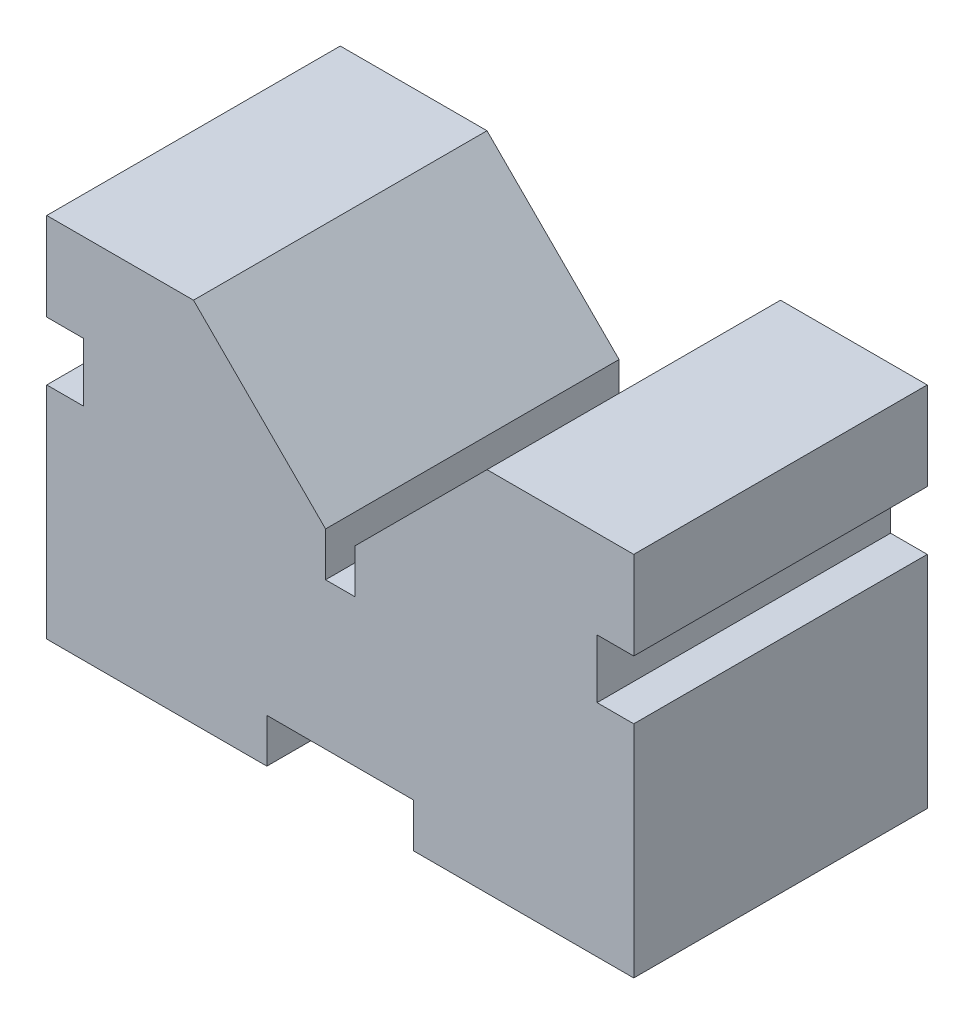
ISO-10303-21;
HEADER;
FILE_DESCRIPTION(('STEP AP214'),'2;1');
FILE_NAME('part.step','',(''),(''),'','','');
FILE_SCHEMA(('AUTOMOTIVE_DESIGN { 1 0 10303 214 1 1 1 1 }'));
ENDSEC;
DATA;
#1=APPLICATION_CONTEXT('core data for automotive mechanical design processes');
#2=APPLICATION_PROTOCOL_DEFINITION('international standard','automotive_design',2000,#1);
#3=PRODUCT_CONTEXT('',#1,'mechanical');
#4=PRODUCT('Part','Part','',(#3));
#5=PRODUCT_RELATED_PRODUCT_CATEGORY('part','',(#4));
#6=PRODUCT_DEFINITION_FORMATION('','',#4);
#7=PRODUCT_DEFINITION_CONTEXT('part definition',#1,'design');
#8=PRODUCT_DEFINITION('design','',#6,#7);
#9=PRODUCT_DEFINITION_SHAPE('','',#8);
#10=(LENGTH_UNIT() NAMED_UNIT(*) SI_UNIT(.MILLI.,.METRE.));
#11=(NAMED_UNIT(*) PLANE_ANGLE_UNIT() SI_UNIT($,.RADIAN.));
#12=(NAMED_UNIT(*) SI_UNIT($,.STERADIAN.) SOLID_ANGLE_UNIT());
#13=UNCERTAINTY_MEASURE_WITH_UNIT(LENGTH_MEASURE(1.E-05),#10,'distance_accuracy_value','');
#14=(GEOMETRIC_REPRESENTATION_CONTEXT(3) GLOBAL_UNCERTAINTY_ASSIGNED_CONTEXT((#13)) GLOBAL_UNIT_ASSIGNED_CONTEXT((#10,
#11,#12)) REPRESENTATION_CONTEXT('',''));
#15=CARTESIAN_POINT('',(0.,0.,0.));
#16=DIRECTION('',(0.,0.,1.));
#17=DIRECTION('',(1.,0.,0.));
#18=AXIS2_PLACEMENT_3D('',#15,#16,#17);
#19=CARTESIAN_POINT('',(-40.,50.,20.));
#20=DIRECTION('',(1.,0.,0.));
#21=DIRECTION('',(0.,0.,-1.));
#22=AXIS2_PLACEMENT_3D('',#19,#20,#21);
#23=PLANE('',#22);
#24=DIRECTION('',(0.,-1.,0.));
#25=VECTOR('',#24,1.);
#26=CARTESIAN_POINT('',(-40.,50.,-20.));
#27=LINE('',#26,#25);
#28=CARTESIAN_POINT('',(-40.,50.,-20.));
#29=VERTEX_POINT('',#28);
#30=CARTESIAN_POINT('',(-40.,38.,-20.));
#31=VERTEX_POINT('',#30);
#32=EDGE_CURVE('E396',#29,#31,#27,.T.);
#33=ORIENTED_EDGE('',*,*,#32,.T.);
#34=DIRECTION('',(0.,0.,1.));
#35=VECTOR('',#34,1.);
#36=CARTESIAN_POINT('',(-40.,38.,-81.));
#37=LINE('',#36,#35);
#38=CARTESIAN_POINT('',(-40.,38.,20.));
#39=VERTEX_POINT('',#38);
#40=EDGE_CURVE('E253',#31,#39,#37,.T.);
#41=ORIENTED_EDGE('',*,*,#40,.T.);
#42=DIRECTION('',(0.,-1.,0.));
#43=VECTOR('',#42,1.);
#44=CARTESIAN_POINT('',(-40.,50.,20.));
#45=LINE('',#44,#43);
#46=CARTESIAN_POINT('',(-40.,50.,20.));
#47=VERTEX_POINT('',#46);
#48=EDGE_CURVE('E409',#47,#39,#45,.T.);
#49=ORIENTED_EDGE('',*,*,#48,.F.);
#50=DIRECTION('',(0.,0.,1.));
#51=VECTOR('',#50,1.);
#52=CARTESIAN_POINT('',(-40.,50.,20.));
#53=LINE('',#52,#51);
#54=EDGE_CURVE('E362',#29,#47,#53,.T.);
#55=ORIENTED_EDGE('',*,*,#54,.F.);
#56=EDGE_LOOP('',(#33,#41,#49,#55));
#57=FACE_BOUND('',#56,.T.);
#58=ADVANCED_FACE('F51',(#57),#23,.F.);
#59=CARTESIAN_POINT('',(40.,50.,-20.));
#60=DIRECTION('',(-1.,0.,0.));
#61=DIRECTION('',(0.,0.,1.));
#62=AXIS2_PLACEMENT_3D('',#59,#60,#61);
#63=PLANE('',#62);
#64=DIRECTION('',(0.,-1.,0.));
#65=VECTOR('',#64,1.);
#66=CARTESIAN_POINT('',(40.,50.,20.));
#67=LINE('',#66,#65);
#68=CARTESIAN_POINT('',(40.,50.,20.));
#69=VERTEX_POINT('',#68);
#70=CARTESIAN_POINT('',(40.,38.,20.));
#71=VERTEX_POINT('',#70);
#72=EDGE_CURVE('E404',#69,#71,#67,.T.);
#73=ORIENTED_EDGE('',*,*,#72,.T.);
#74=DIRECTION('',(0.,0.,1.));
#75=VECTOR('',#74,1.);
#76=CARTESIAN_POINT('',(40.,38.,-81.));
#77=LINE('',#76,#75);
#78=CARTESIAN_POINT('',(40.,38.,-20.));
#79=VERTEX_POINT('',#78);
#80=EDGE_CURVE('E268',#79,#71,#77,.T.);
#81=ORIENTED_EDGE('',*,*,#80,.F.);
#82=DIRECTION('',(0.,-1.,0.));
#83=VECTOR('',#82,1.);
#84=CARTESIAN_POINT('',(40.,50.,-20.));
#85=LINE('',#84,#83);
#86=CARTESIAN_POINT('',(40.,50.,-20.));
#87=VERTEX_POINT('',#86);
#88=EDGE_CURVE('E400',#87,#79,#85,.T.);
#89=ORIENTED_EDGE('',*,*,#88,.F.);
#90=DIRECTION('',(0.,0.,-1.));
#91=VECTOR('',#90,1.);
#92=CARTESIAN_POINT('',(40.,50.,-20.));
#93=LINE('',#92,#91);
#94=EDGE_CURVE('E372',#69,#87,#93,.T.);
#95=ORIENTED_EDGE('',*,*,#94,.F.);
#96=EDGE_LOOP('',(#73,#81,#89,#95));
#97=FACE_BOUND('',#96,.T.);
#98=ADVANCED_FACE('F479',(#97),#63,.F.);
#99=CARTESIAN_POINT('',(0.,0.,0.));
#100=DIRECTION('',(0.,-1.,0.));
#101=DIRECTION('',(0.,0.,-1.));
#102=AXIS2_PLACEMENT_3D('',#99,#100,#101);
#103=PLANE('',#102);
#104=DIRECTION('',(0.,0.,-1.));
#105=VECTOR('',#104,1.);
#106=CARTESIAN_POINT('',(-10.,0.,0.));
#107=LINE('',#106,#105);
#108=CARTESIAN_POINT('',(-10.,0.,20.));
#109=VERTEX_POINT('',#108);
#110=CARTESIAN_POINT('',(-10.,0.,-20.));
#111=VERTEX_POINT('',#110);
#112=EDGE_CURVE('E435',#109,#111,#107,.T.);
#113=ORIENTED_EDGE('',*,*,#112,.F.);
#114=DIRECTION('',(1.,0.,0.));
#115=VECTOR('',#114,1.);
#116=CARTESIAN_POINT('',(40.,0.,20.));
#117=LINE('',#116,#115);
#118=CARTESIAN_POINT('',(-40.,0.,20.));
#119=VERTEX_POINT('',#118);
#120=EDGE_CURVE('E385',#119,#109,#117,.T.);
#121=ORIENTED_EDGE('',*,*,#120,.F.);
#122=DIRECTION('',(0.,0.,1.));
#123=VECTOR('',#122,1.);
#124=CARTESIAN_POINT('',(-40.,0.,20.));
#125=LINE('',#124,#123);
#126=CARTESIAN_POINT('',(-40.,0.,-20.));
#127=VERTEX_POINT('',#126);
#128=EDGE_CURVE('E361',#127,#119,#125,.T.);
#129=ORIENTED_EDGE('',*,*,#128,.F.);
#130=DIRECTION('',(-1.,0.,0.));
#131=VECTOR('',#130,1.);
#132=CARTESIAN_POINT('',(-40.,0.,-20.));
#133=LINE('',#132,#131);
#134=EDGE_CURVE('E393',#111,#127,#133,.T.);
#135=ORIENTED_EDGE('',*,*,#134,.F.);
#136=EDGE_LOOP('',(#113,#121,#129,#135));
#137=FACE_BOUND('',#136,.T.);
#138=ADVANCED_FACE('F464',(#137),#103,.T.);
#139=CARTESIAN_POINT('',(0.,50.,0.));
#140=DIRECTION('',(0.,-1.,0.));
#141=DIRECTION('',(0.,0.,-1.));
#142=AXIS2_PLACEMENT_3D('',#139,#140,#141);
#143=PLANE('',#142);
#144=DIRECTION('',(1.,0.,0.));
#145=VECTOR('',#144,1.);
#146=CARTESIAN_POINT('',(40.,50.,20.));
#147=LINE('',#146,#145);
#148=CARTESIAN_POINT('',(-20.,50.,20.));
#149=VERTEX_POINT('',#148);
#150=EDGE_CURVE('E368',#47,#149,#147,.T.);
#151=ORIENTED_EDGE('',*,*,#150,.T.);
#152=DIRECTION('',(0.,0.,-1.));
#153=VECTOR('',#152,1.);
#154=CARTESIAN_POINT('',(-20.,50.,0.));
#155=LINE('',#154,#153);
#156=CARTESIAN_POINT('',(-20.,50.,-20.));
#157=VERTEX_POINT('',#156);
#158=EDGE_CURVE('E417',#149,#157,#155,.T.);
#159=ORIENTED_EDGE('',*,*,#158,.T.);
#160=DIRECTION('',(-1.,0.,0.));
#161=VECTOR('',#160,1.);
#162=CARTESIAN_POINT('',(-40.,50.,-20.));
#163=LINE('',#162,#161);
#164=EDGE_CURVE('E375',#157,#29,#163,.T.);
#165=ORIENTED_EDGE('',*,*,#164,.T.);
#166=ORIENTED_EDGE('',*,*,#54,.T.);
#167=EDGE_LOOP('',(#151,#159,#165,#166));
#168=FACE_BOUND('',#167,.T.);
#169=ADVANCED_FACE('F498',(#168),#143,.F.);
#170=CARTESIAN_POINT('',(-40.,30.,20.));
#171=VERTEX_POINT('',#170);
#172=EDGE_CURVE('E408',#171,#119,#45,.T.);
#173=ORIENTED_EDGE('',*,*,#172,.F.);
#174=DIRECTION('',(0.,0.,1.));
#175=VECTOR('',#174,1.);
#176=CARTESIAN_POINT('',(-40.,30.,-81.));
#177=LINE('',#176,#175);
#178=CARTESIAN_POINT('',(-40.,30.,-20.));
#179=VERTEX_POINT('',#178);
#180=EDGE_CURVE('E219',#179,#171,#177,.T.);
#181=ORIENTED_EDGE('',*,*,#180,.F.);
#182=EDGE_CURVE('E380',#179,#127,#27,.T.);
#183=ORIENTED_EDGE('',*,*,#182,.T.);
#184=ORIENTED_EDGE('',*,*,#128,.T.);
#185=EDGE_LOOP('',(#173,#181,#183,#184));
#186=FACE_BOUND('',#185,.T.);
#187=ADVANCED_FACE('F54',(#186),#23,.F.);
#188=CARTESIAN_POINT('',(40.,50.,20.));
#189=DIRECTION('',(0.,0.,-1.));
#190=DIRECTION('',(-1.,0.,0.));
#191=AXIS2_PLACEMENT_3D('',#188,#189,#190);
#192=PLANE('',#191);
#193=ORIENTED_EDGE('',*,*,#48,.T.);
#194=DIRECTION('',(1.,0.,0.));
#195=VECTOR('',#194,1.);
#196=CARTESIAN_POINT('',(40.,38.,20.));
#197=LINE('',#196,#195);
#198=CARTESIAN_POINT('',(-35.,38.,20.));
#199=VERTEX_POINT('',#198);
#200=EDGE_CURVE('E288',#39,#199,#197,.T.);
#201=ORIENTED_EDGE('',*,*,#200,.T.);
#202=DIRECTION('',(0.,-1.,0.));
#203=VECTOR('',#202,1.);
#204=CARTESIAN_POINT('',(-35.,50.,20.));
#205=LINE('',#204,#203);
#206=CARTESIAN_POINT('',(-35.,30.,20.));
#207=VERTEX_POINT('',#206);
#208=EDGE_CURVE('E249',#199,#207,#205,.T.);
#209=ORIENTED_EDGE('',*,*,#208,.T.);
#210=DIRECTION('',(-1.,0.,0.));
#211=VECTOR('',#210,1.);
#212=CARTESIAN_POINT('',(40.,30.,20.));
#213=LINE('',#212,#211);
#214=EDGE_CURVE('E282',#207,#171,#213,.T.);
#215=ORIENTED_EDGE('',*,*,#214,.T.);
#216=ORIENTED_EDGE('',*,*,#172,.T.);
#217=ORIENTED_EDGE('',*,*,#120,.T.);
#218=DIRECTION('',(0.,1.,0.));
#219=VECTOR('',#218,1.);
#220=CARTESIAN_POINT('',(-10.,50.,20.));
#221=LINE('',#220,#219);
#222=CARTESIAN_POINT('',(-10.,6.,20.));
#223=VERTEX_POINT('',#222);
#224=EDGE_CURVE('E310',#109,#223,#221,.T.);
#225=ORIENTED_EDGE('',*,*,#224,.T.);
#226=DIRECTION('',(1.,0.,0.));
#227=VECTOR('',#226,1.);
#228=CARTESIAN_POINT('',(40.,6.,20.));
#229=LINE('',#228,#227);
#230=CARTESIAN_POINT('',(10.,6.,20.));
#231=VERTEX_POINT('',#230);
#232=EDGE_CURVE('E314',#223,#231,#229,.T.);
#233=ORIENTED_EDGE('',*,*,#232,.T.);
#234=DIRECTION('',(0.,-1.,0.));
#235=VECTOR('',#234,1.);
#236=CARTESIAN_POINT('',(10.,50.,20.));
#237=LINE('',#236,#235);
#238=CARTESIAN_POINT('',(10.,0.,20.));
#239=VERTEX_POINT('',#238);
#240=EDGE_CURVE('E303',#231,#239,#237,.T.);
#241=ORIENTED_EDGE('',*,*,#240,.T.);
#242=CARTESIAN_POINT('',(40.,0.,20.));
#243=VERTEX_POINT('',#242);
#244=EDGE_CURVE('E384',#239,#243,#117,.T.);
#245=ORIENTED_EDGE('',*,*,#244,.T.);
#246=CARTESIAN_POINT('',(40.,30.,20.));
#247=VERTEX_POINT('',#246);
#248=EDGE_CURVE('E403',#247,#243,#67,.T.);
#249=ORIENTED_EDGE('',*,*,#248,.F.);
#250=DIRECTION('',(-1.,0.,0.));
#251=VECTOR('',#250,1.);
#252=CARTESIAN_POINT('',(40.,30.,20.));
#253=LINE('',#252,#251);
#254=CARTESIAN_POINT('',(35.,30.,20.));
#255=VERTEX_POINT('',#254);
#256=EDGE_CURVE('E259',#247,#255,#253,.T.);
#257=ORIENTED_EDGE('',*,*,#256,.T.);
#258=DIRECTION('',(0.,1.,0.));
#259=VECTOR('',#258,1.);
#260=CARTESIAN_POINT('',(35.,50.,20.));
#261=LINE('',#260,#259);
#262=CARTESIAN_POINT('',(35.,38.,20.));
#263=VERTEX_POINT('',#262);
#264=EDGE_CURVE('E217',#255,#263,#261,.T.);
#265=ORIENTED_EDGE('',*,*,#264,.T.);
#266=DIRECTION('',(1.,0.,0.));
#267=VECTOR('',#266,1.);
#268=CARTESIAN_POINT('',(40.,38.,20.));
#269=LINE('',#268,#267);
#270=EDGE_CURVE('E276',#263,#71,#269,.T.);
#271=ORIENTED_EDGE('',*,*,#270,.T.);
#272=ORIENTED_EDGE('',*,*,#72,.F.);
#273=CARTESIAN_POINT('',(20.,50.,20.));
#274=VERTEX_POINT('',#273);
#275=EDGE_CURVE('E366',#274,#69,#147,.T.);
#276=ORIENTED_EDGE('',*,*,#275,.F.);
#277=DIRECTION('',(-0.707106781186548,-0.707106781186548,0.));
#278=VECTOR('',#277,1.);
#279=CARTESIAN_POINT('',(30.,60.,20.));
#280=LINE('',#279,#278);
#281=CARTESIAN_POINT('',(2.,32.,20.));
#282=VERTEX_POINT('',#281);
#283=EDGE_CURVE('E338',#274,#282,#280,.T.);
#284=ORIENTED_EDGE('',*,*,#283,.T.);
#285=DIRECTION('',(0.,-1.,0.));
#286=VECTOR('',#285,1.);
#287=CARTESIAN_POINT('',(2.,50.,20.));
#288=LINE('',#287,#286);
#289=CARTESIAN_POINT('',(2.,26.,20.));
#290=VERTEX_POINT('',#289);
#291=EDGE_CURVE('E358',#282,#290,#288,.T.);
#292=ORIENTED_EDGE('',*,*,#291,.T.);
#293=DIRECTION('',(-1.,0.,0.));
#294=VECTOR('',#293,1.);
#295=CARTESIAN_POINT('',(40.,26.,20.));
#296=LINE('',#295,#294);
#297=CARTESIAN_POINT('',(-2.,26.,20.));
#298=VERTEX_POINT('',#297);
#299=EDGE_CURVE('E354',#290,#298,#296,.T.);
#300=ORIENTED_EDGE('',*,*,#299,.T.);
#301=DIRECTION('',(0.,1.,0.));
#302=VECTOR('',#301,1.);
#303=CARTESIAN_POINT('',(-2.,50.,20.));
#304=LINE('',#303,#302);
#305=CARTESIAN_POINT('',(-2.,32.,20.));
#306=VERTEX_POINT('',#305);
#307=EDGE_CURVE('E350',#298,#306,#304,.T.);
#308=ORIENTED_EDGE('',*,*,#307,.T.);
#309=DIRECTION('',(-0.707106781186548,0.707106781186548,0.));
#310=VECTOR('',#309,1.);
#311=CARTESIAN_POINT('',(10.,20.,20.));
#312=LINE('',#311,#310);
#313=EDGE_CURVE('E346',#306,#149,#312,.T.);
#314=ORIENTED_EDGE('',*,*,#313,.T.);
#315=ORIENTED_EDGE('',*,*,#150,.F.);
#316=EDGE_LOOP('',(#193,#201,#209,#215,#216,#217,#225,#233,#241,#245,#249,#257,#265,#271,#272,
#276,#284,#292,#300,#308,#314,#315));
#317=FACE_BOUND('',#316,.T.);
#318=ADVANCED_FACE('F450',(#317),#192,.F.);
#319=CARTESIAN_POINT('',(40.,30.,-20.));
#320=VERTEX_POINT('',#319);
#321=CARTESIAN_POINT('',(40.,0.,-20.));
#322=VERTEX_POINT('',#321);
#323=EDGE_CURVE('E399',#320,#322,#85,.T.);
#324=ORIENTED_EDGE('',*,*,#323,.F.);
#325=DIRECTION('',(0.,0.,1.));
#326=VECTOR('',#325,1.);
#327=CARTESIAN_POINT('',(40.,30.,-81.));
#328=LINE('',#327,#326);
#329=EDGE_CURVE('E76',#320,#247,#328,.T.);
#330=ORIENTED_EDGE('',*,*,#329,.T.);
#331=ORIENTED_EDGE('',*,*,#248,.T.);
#332=DIRECTION('',(0.,0.,-1.));
#333=VECTOR('',#332,1.);
#334=CARTESIAN_POINT('',(40.,0.,-20.));
#335=LINE('',#334,#333);
#336=EDGE_CURVE('E389',#243,#322,#335,.T.);
#337=ORIENTED_EDGE('',*,*,#336,.T.);
#338=EDGE_LOOP('',(#324,#330,#331,#337));
#339=FACE_BOUND('',#338,.T.);
#340=ADVANCED_FACE('F472',(#339),#63,.F.);
#341=CARTESIAN_POINT('',(-40.,50.,-20.));
#342=DIRECTION('',(0.,0.,1.));
#343=DIRECTION('',(1.,0.,0.));
#344=AXIS2_PLACEMENT_3D('',#341,#342,#343);
#345=PLANE('',#344);
#346=DIRECTION('',(0.,1.,0.));
#347=VECTOR('',#346,1.);
#348=CARTESIAN_POINT('',(-35.,50.,-20.));
#349=LINE('',#348,#347);
#350=CARTESIAN_POINT('',(-35.,30.,-20.));
#351=VERTEX_POINT('',#350);
#352=CARTESIAN_POINT('',(-35.,38.,-20.));
#353=VERTEX_POINT('',#352);
#354=EDGE_CURVE('E61',#351,#353,#349,.T.);
#355=ORIENTED_EDGE('',*,*,#354,.T.);
#356=DIRECTION('',(-1.,0.,0.));
#357=VECTOR('',#356,1.);
#358=CARTESIAN_POINT('',(-40.,38.,-20.));
#359=LINE('',#358,#357);
#360=EDGE_CURVE('E11',#353,#31,#359,.T.);
#361=ORIENTED_EDGE('',*,*,#360,.T.);
#362=ORIENTED_EDGE('',*,*,#32,.F.);
#363=ORIENTED_EDGE('',*,*,#164,.F.);
#364=DIRECTION('',(0.707106781186548,-0.707106781186548,0.));
#365=VECTOR('',#364,1.);
#366=CARTESIAN_POINT('',(-30.,60.,-20.));
#367=LINE('',#366,#365);
#368=CARTESIAN_POINT('',(-2.,32.,-20.));
#369=VERTEX_POINT('',#368);
#370=EDGE_CURVE('E342',#157,#369,#367,.T.);
#371=ORIENTED_EDGE('',*,*,#370,.T.);
#372=DIRECTION('',(0.,-1.,0.));
#373=VECTOR('',#372,1.);
#374=CARTESIAN_POINT('',(-2.,50.,-20.));
#375=LINE('',#374,#373);
#376=CARTESIAN_POINT('',(-2.,26.,-20.));
#377=VERTEX_POINT('',#376);
#378=EDGE_CURVE('E421',#369,#377,#375,.T.);
#379=ORIENTED_EDGE('',*,*,#378,.T.);
#380=DIRECTION('',(1.,0.,0.));
#381=VECTOR('',#380,1.);
#382=CARTESIAN_POINT('',(-40.,26.,-20.));
#383=LINE('',#382,#381);
#384=CARTESIAN_POINT('',(2.,26.,-20.));
#385=VERTEX_POINT('',#384);
#386=EDGE_CURVE('E425',#377,#385,#383,.T.);
#387=ORIENTED_EDGE('',*,*,#386,.T.);
#388=DIRECTION('',(0.,1.,0.));
#389=VECTOR('',#388,1.);
#390=CARTESIAN_POINT('',(2.,50.,-20.));
#391=LINE('',#390,#389);
#392=CARTESIAN_POINT('',(2.,32.,-20.));
#393=VERTEX_POINT('',#392);
#394=EDGE_CURVE('E429',#385,#393,#391,.T.);
#395=ORIENTED_EDGE('',*,*,#394,.T.);
#396=DIRECTION('',(0.707106781186548,0.707106781186548,0.));
#397=VECTOR('',#396,1.);
#398=CARTESIAN_POINT('',(-10.,20.,-20.));
#399=LINE('',#398,#397);
#400=CARTESIAN_POINT('',(20.,50.,-20.));
#401=VERTEX_POINT('',#400);
#402=EDGE_CURVE('E323',#393,#401,#399,.T.);
#403=ORIENTED_EDGE('',*,*,#402,.T.);
#404=EDGE_CURVE('E376',#87,#401,#163,.T.);
#405=ORIENTED_EDGE('',*,*,#404,.F.);
#406=ORIENTED_EDGE('',*,*,#88,.T.);
#407=DIRECTION('',(-1.,0.,0.));
#408=VECTOR('',#407,1.);
#409=CARTESIAN_POINT('',(-40.,38.,-20.));
#410=LINE('',#409,#408);
#411=CARTESIAN_POINT('',(35.,38.,-20.));
#412=VERTEX_POINT('',#411);
#413=EDGE_CURVE('E225',#79,#412,#410,.T.);
#414=ORIENTED_EDGE('',*,*,#413,.T.);
#415=DIRECTION('',(0.,-1.,0.));
#416=VECTOR('',#415,1.);
#417=CARTESIAN_POINT('',(35.,50.,-20.));
#418=LINE('',#417,#416);
#419=CARTESIAN_POINT('',(35.,30.,-20.));
#420=VERTEX_POINT('',#419);
#421=EDGE_CURVE('E209',#412,#420,#418,.T.);
#422=ORIENTED_EDGE('',*,*,#421,.T.);
#423=DIRECTION('',(1.,0.,0.));
#424=VECTOR('',#423,1.);
#425=CARTESIAN_POINT('',(-40.,30.,-20.));
#426=LINE('',#425,#424);
#427=EDGE_CURVE('E200',#420,#320,#426,.T.);
#428=ORIENTED_EDGE('',*,*,#427,.T.);
#429=ORIENTED_EDGE('',*,*,#323,.T.);
#430=CARTESIAN_POINT('',(10.,0.,-20.));
#431=VERTEX_POINT('',#430);
#432=EDGE_CURVE('E367',#322,#431,#133,.T.);
#433=ORIENTED_EDGE('',*,*,#432,.T.);
#434=DIRECTION('',(0.,1.,0.));
#435=VECTOR('',#434,1.);
#436=CARTESIAN_POINT('',(10.,50.,-20.));
#437=LINE('',#436,#435);
#438=CARTESIAN_POINT('',(10.,6.,-20.));
#439=VERTEX_POINT('',#438);
#440=EDGE_CURVE('E296',#431,#439,#437,.T.);
#441=ORIENTED_EDGE('',*,*,#440,.T.);
#442=DIRECTION('',(-1.,0.,0.));
#443=VECTOR('',#442,1.);
#444=CARTESIAN_POINT('',(-40.,6.,-20.));
#445=LINE('',#444,#443);
#446=CARTESIAN_POINT('',(-10.,6.,-20.));
#447=VERTEX_POINT('',#446);
#448=EDGE_CURVE('E210',#439,#447,#445,.T.);
#449=ORIENTED_EDGE('',*,*,#448,.T.);
#450=DIRECTION('',(0.,-1.,0.));
#451=VECTOR('',#450,1.);
#452=CARTESIAN_POINT('',(-10.,50.,-20.));
#453=LINE('',#452,#451);
#454=EDGE_CURVE('E306',#447,#111,#453,.T.);
#455=ORIENTED_EDGE('',*,*,#454,.T.);
#456=ORIENTED_EDGE('',*,*,#134,.T.);
#457=ORIENTED_EDGE('',*,*,#182,.F.);
#458=DIRECTION('',(1.,0.,0.));
#459=VECTOR('',#458,1.);
#460=CARTESIAN_POINT('',(-40.,30.,-20.));
#461=LINE('',#460,#459);
#462=EDGE_CURVE('E231',#179,#351,#461,.T.);
#463=ORIENTED_EDGE('',*,*,#462,.T.);
#464=EDGE_LOOP('',(#355,#361,#362,#363,#371,#379,#387,#395,#403,#405,#406,#414,#422,#428,#429,
#433,#441,#449,#455,#456,#457,#463));
#465=FACE_BOUND('',#464,.T.);
#466=ADVANCED_FACE('F223',(#465),#345,.F.);
#467=ORIENTED_EDGE('',*,*,#404,.T.);
#468=DIRECTION('',(0.,0.,1.));
#469=VECTOR('',#468,1.);
#470=CARTESIAN_POINT('',(20.,50.,0.));
#471=LINE('',#470,#469);
#472=EDGE_CURVE('E413',#401,#274,#471,.T.);
#473=ORIENTED_EDGE('',*,*,#472,.T.);
#474=ORIENTED_EDGE('',*,*,#275,.T.);
#475=ORIENTED_EDGE('',*,*,#94,.T.);
#476=EDGE_LOOP('',(#467,#473,#474,#475));
#477=FACE_BOUND('',#476,.T.);
#478=ADVANCED_FACE('F483',(#477),#143,.F.);
#479=DIRECTION('',(0.,0.,1.));
#480=VECTOR('',#479,1.);
#481=CARTESIAN_POINT('',(10.,0.,0.));
#482=LINE('',#481,#480);
#483=EDGE_CURVE('E433',#431,#239,#482,.T.);
#484=ORIENTED_EDGE('',*,*,#483,.F.);
#485=ORIENTED_EDGE('',*,*,#432,.F.);
#486=ORIENTED_EDGE('',*,*,#336,.F.);
#487=ORIENTED_EDGE('',*,*,#244,.F.);
#488=EDGE_LOOP('',(#484,#485,#486,#487));
#489=FACE_BOUND('',#488,.T.);
#490=ADVANCED_FACE('F454',(#489),#103,.T.);
#491=CARTESIAN_POINT('',(2.,32.,-81.));
#492=DIRECTION('',(1.,0.,0.));
#493=DIRECTION('',(0.,0.,-1.));
#494=AXIS2_PLACEMENT_3D('',#491,#492,#493);
#495=PLANE('',#494);
#496=DIRECTION('',(0.,0.,1.));
#497=VECTOR('',#496,1.);
#498=CARTESIAN_POINT('',(2.,32.,-81.));
#499=LINE('',#498,#497);
#500=EDGE_CURVE('E319',#393,#282,#499,.T.);
#501=ORIENTED_EDGE('',*,*,#500,.F.);
#502=ORIENTED_EDGE('',*,*,#394,.F.);
#503=DIRECTION('',(0.,0.,1.));
#504=VECTOR('',#503,1.);
#505=CARTESIAN_POINT('',(2.,26.,-81.));
#506=LINE('',#505,#504);
#507=EDGE_CURVE('E324',#385,#290,#506,.T.);
#508=ORIENTED_EDGE('',*,*,#507,.T.);
#509=ORIENTED_EDGE('',*,*,#291,.F.);
#510=EDGE_LOOP('',(#501,#502,#508,#509));
#511=FACE_BOUND('',#510,.T.);
#512=ADVANCED_FACE('F488',(#511),#495,.F.);
#513=CARTESIAN_POINT('',(2.,26.,-81.));
#514=DIRECTION('',(0.,-1.,0.));
#515=DIRECTION('',(0.,0.,-1.));
#516=AXIS2_PLACEMENT_3D('',#513,#514,#515);
#517=PLANE('',#516);
#518=ORIENTED_EDGE('',*,*,#507,.F.);
#519=ORIENTED_EDGE('',*,*,#386,.F.);
#520=DIRECTION('',(0.,0.,1.));
#521=VECTOR('',#520,1.);
#522=CARTESIAN_POINT('',(-2.,26.,-81.));
#523=LINE('',#522,#521);
#524=EDGE_CURVE('E328',#377,#298,#523,.T.);
#525=ORIENTED_EDGE('',*,*,#524,.T.);
#526=ORIENTED_EDGE('',*,*,#299,.F.);
#527=EDGE_LOOP('',(#518,#519,#525,#526));
#528=FACE_BOUND('',#527,.T.);
#529=ADVANCED_FACE('F492',(#528),#517,.F.);
#530=CARTESIAN_POINT('',(-2.,26.,-81.));
#531=DIRECTION('',(-1.,0.,0.));
#532=DIRECTION('',(0.,0.,1.));
#533=AXIS2_PLACEMENT_3D('',#530,#531,#532);
#534=PLANE('',#533);
#535=ORIENTED_EDGE('',*,*,#524,.F.);
#536=ORIENTED_EDGE('',*,*,#378,.F.);
#537=DIRECTION('',(0.,0.,1.));
#538=VECTOR('',#537,1.);
#539=CARTESIAN_POINT('',(-2.,32.,-81.));
#540=LINE('',#539,#538);
#541=EDGE_CURVE('E318',#369,#306,#540,.T.);
#542=ORIENTED_EDGE('',*,*,#541,.T.);
#543=ORIENTED_EDGE('',*,*,#307,.F.);
#544=EDGE_LOOP('',(#535,#536,#542,#543));
#545=FACE_BOUND('',#544,.T.);
#546=ADVANCED_FACE('F494',(#545),#534,.F.);
#547=CARTESIAN_POINT('',(-2.,32.,-81.));
#548=DIRECTION('',(-0.707106781186547,-0.707106781186547,0.));
#549=DIRECTION('',(0.707106781186548,-0.707106781186548,0.));
#550=AXIS2_PLACEMENT_3D('',#547,#548,#549);
#551=PLANE('',#550);
#552=ORIENTED_EDGE('',*,*,#541,.F.);
#553=ORIENTED_EDGE('',*,*,#370,.F.);
#554=ORIENTED_EDGE('',*,*,#158,.F.);
#555=ORIENTED_EDGE('',*,*,#313,.F.);
#556=EDGE_LOOP('',(#552,#553,#554,#555));
#557=FACE_BOUND('',#556,.T.);
#558=ADVANCED_FACE('F559',(#557),#551,.F.);
#559=CARTESIAN_POINT('',(20.,50.,-81.));
#560=DIRECTION('',(0.707106781186547,-0.707106781186547,0.));
#561=DIRECTION('',(0.707106781186548,0.707106781186548,0.));
#562=AXIS2_PLACEMENT_3D('',#559,#560,#561);
#563=PLANE('',#562);
#564=ORIENTED_EDGE('',*,*,#472,.F.);
#565=ORIENTED_EDGE('',*,*,#402,.F.);
#566=ORIENTED_EDGE('',*,*,#500,.T.);
#567=ORIENTED_EDGE('',*,*,#283,.F.);
#568=EDGE_LOOP('',(#564,#565,#566,#567));
#569=FACE_BOUND('',#568,.T.);
#570=ADVANCED_FACE('F485',(#569),#563,.F.);
#571=CARTESIAN_POINT('',(10.,6.,-81.));
#572=DIRECTION('',(0.,1.,0.));
#573=DIRECTION('',(0.,0.,1.));
#574=AXIS2_PLACEMENT_3D('',#571,#572,#573);
#575=PLANE('',#574);
#576=DIRECTION('',(0.,0.,1.));
#577=VECTOR('',#576,1.);
#578=CARTESIAN_POINT('',(-10.,6.,-81.));
#579=LINE('',#578,#577);
#580=EDGE_CURVE('E292',#447,#223,#579,.T.);
#581=ORIENTED_EDGE('',*,*,#580,.F.);
#582=ORIENTED_EDGE('',*,*,#448,.F.);
#583=DIRECTION('',(0.,0.,1.));
#584=VECTOR('',#583,1.);
#585=CARTESIAN_POINT('',(10.,6.,-81.));
#586=LINE('',#585,#584);
#587=EDGE_CURVE('E291',#439,#231,#586,.T.);
#588=ORIENTED_EDGE('',*,*,#587,.T.);
#589=ORIENTED_EDGE('',*,*,#232,.F.);
#590=EDGE_LOOP('',(#581,#582,#588,#589));
#591=FACE_BOUND('',#590,.T.);
#592=ADVANCED_FACE('F443',(#591),#575,.F.);
#593=CARTESIAN_POINT('',(-10.,6.,-81.));
#594=DIRECTION('',(-1.,0.,0.));
#595=DIRECTION('',(0.,0.,1.));
#596=AXIS2_PLACEMENT_3D('',#593,#594,#595);
#597=PLANE('',#596);
#598=ORIENTED_EDGE('',*,*,#112,.T.);
#599=ORIENTED_EDGE('',*,*,#454,.F.);
#600=ORIENTED_EDGE('',*,*,#580,.T.);
#601=ORIENTED_EDGE('',*,*,#224,.F.);
#602=EDGE_LOOP('',(#598,#599,#600,#601));
#603=FACE_BOUND('',#602,.T.);
#604=ADVANCED_FACE('F553',(#603),#597,.F.);
#605=CARTESIAN_POINT('',(10.,0.,-81.));
#606=DIRECTION('',(1.,0.,0.));
#607=DIRECTION('',(0.,0.,-1.));
#608=AXIS2_PLACEMENT_3D('',#605,#606,#607);
#609=PLANE('',#608);
#610=ORIENTED_EDGE('',*,*,#587,.F.);
#611=ORIENTED_EDGE('',*,*,#440,.F.);
#612=ORIENTED_EDGE('',*,*,#483,.T.);
#613=ORIENTED_EDGE('',*,*,#240,.F.);
#614=EDGE_LOOP('',(#610,#611,#612,#613));
#615=FACE_BOUND('',#614,.T.);
#616=ADVANCED_FACE('F445',(#615),#609,.F.);
#617=CARTESIAN_POINT('',(35.,38.,-81.));
#618=DIRECTION('',(-1.,0.,0.));
#619=DIRECTION('',(0.,0.,1.));
#620=AXIS2_PLACEMENT_3D('',#617,#618,#619);
#621=PLANE('',#620);
#622=DIRECTION('',(0.,0.,1.));
#623=VECTOR('',#622,1.);
#624=CARTESIAN_POINT('',(35.,30.,-81.));
#625=LINE('',#624,#623);
#626=EDGE_CURVE('E203',#420,#255,#625,.T.);
#627=ORIENTED_EDGE('',*,*,#626,.F.);
#628=ORIENTED_EDGE('',*,*,#421,.F.);
#629=DIRECTION('',(0.,0.,1.));
#630=VECTOR('',#629,1.);
#631=CARTESIAN_POINT('',(35.,38.,-81.));
#632=LINE('',#631,#630);
#633=EDGE_CURVE('E271',#412,#263,#632,.T.);
#634=ORIENTED_EDGE('',*,*,#633,.T.);
#635=ORIENTED_EDGE('',*,*,#264,.F.);
#636=EDGE_LOOP('',(#627,#628,#634,#635));
#637=FACE_BOUND('',#636,.T.);
#638=ADVANCED_FACE('F213',(#637),#621,.F.);
#639=CARTESIAN_POINT('',(40.,38.,-81.));
#640=DIRECTION('',(0.,1.,0.));
#641=DIRECTION('',(0.,0.,1.));
#642=AXIS2_PLACEMENT_3D('',#639,#640,#641);
#643=PLANE('',#642);
#644=ORIENTED_EDGE('',*,*,#633,.F.);
#645=ORIENTED_EDGE('',*,*,#413,.F.);
#646=ORIENTED_EDGE('',*,*,#80,.T.);
#647=ORIENTED_EDGE('',*,*,#270,.F.);
#648=EDGE_LOOP('',(#644,#645,#646,#647));
#649=FACE_BOUND('',#648,.T.);
#650=ADVANCED_FACE('F511',(#649),#643,.F.);
#651=CARTESIAN_POINT('',(35.,30.,-81.));
#652=DIRECTION('',(0.,-1.,0.));
#653=DIRECTION('',(0.,0.,-1.));
#654=AXIS2_PLACEMENT_3D('',#651,#652,#653);
#655=PLANE('',#654);
#656=ORIENTED_EDGE('',*,*,#329,.F.);
#657=ORIENTED_EDGE('',*,*,#427,.F.);
#658=ORIENTED_EDGE('',*,*,#626,.T.);
#659=ORIENTED_EDGE('',*,*,#256,.F.);
#660=EDGE_LOOP('',(#656,#657,#658,#659));
#661=FACE_BOUND('',#660,.T.);
#662=ADVANCED_FACE('F202',(#661),#655,.F.);
#663=CARTESIAN_POINT('',(-35.,38.,-81.));
#664=DIRECTION('',(0.,1.,0.));
#665=DIRECTION('',(0.,0.,1.));
#666=AXIS2_PLACEMENT_3D('',#663,#664,#665);
#667=PLANE('',#666);
#668=ORIENTED_EDGE('',*,*,#40,.F.);
#669=ORIENTED_EDGE('',*,*,#360,.F.);
#670=DIRECTION('',(0.,0.,1.));
#671=VECTOR('',#670,1.);
#672=CARTESIAN_POINT('',(-35.,38.,-81.));
#673=LINE('',#672,#671);
#674=EDGE_CURVE('E248',#353,#199,#673,.T.);
#675=ORIENTED_EDGE('',*,*,#674,.T.);
#676=ORIENTED_EDGE('',*,*,#200,.F.);
#677=EDGE_LOOP('',(#668,#669,#675,#676));
#678=FACE_BOUND('',#677,.T.);
#679=ADVANCED_FACE('F503',(#678),#667,.F.);
#680=CARTESIAN_POINT('',(-35.,30.,-81.));
#681=DIRECTION('',(1.,0.,0.));
#682=DIRECTION('',(0.,0.,-1.));
#683=AXIS2_PLACEMENT_3D('',#680,#681,#682);
#684=PLANE('',#683);
#685=ORIENTED_EDGE('',*,*,#674,.F.);
#686=ORIENTED_EDGE('',*,*,#354,.F.);
#687=DIRECTION('',(0.,0.,1.));
#688=VECTOR('',#687,1.);
#689=CARTESIAN_POINT('',(-35.,30.,-81.));
#690=LINE('',#689,#688);
#691=EDGE_CURVE('E68',#351,#207,#690,.T.);
#692=ORIENTED_EDGE('',*,*,#691,.T.);
#693=ORIENTED_EDGE('',*,*,#208,.F.);
#694=EDGE_LOOP('',(#685,#686,#692,#693));
#695=FACE_BOUND('',#694,.T.);
#696=ADVANCED_FACE('F245',(#695),#684,.F.);
#697=CARTESIAN_POINT('',(-40.,30.,-81.));
#698=DIRECTION('',(0.,-1.,0.));
#699=DIRECTION('',(0.,0.,-1.));
#700=AXIS2_PLACEMENT_3D('',#697,#698,#699);
#701=PLANE('',#700);
#702=ORIENTED_EDGE('',*,*,#691,.F.);
#703=ORIENTED_EDGE('',*,*,#462,.F.);
#704=ORIENTED_EDGE('',*,*,#180,.T.);
#705=ORIENTED_EDGE('',*,*,#214,.F.);
#706=EDGE_LOOP('',(#702,#703,#704,#705));
#707=FACE_BOUND('',#706,.T.);
#708=ADVANCED_FACE('F509',(#707),#701,.F.);
#709=CLOSED_SHELL('',(#58,#98,#138,#169,#187,#318,#340,#466,#478,#490,#512,#529,#546,#558,#570,
#592,#604,#616,#638,#650,#662,#679,#696,#708));
#710=MANIFOLD_SOLID_BREP('B2',#709);
#711=ADVANCED_BREP_SHAPE_REPRESENTATION('',(#18,#710),#14);
#712=SHAPE_DEFINITION_REPRESENTATION(#9,#711);
ENDSEC;
END-ISO-10303-21;
